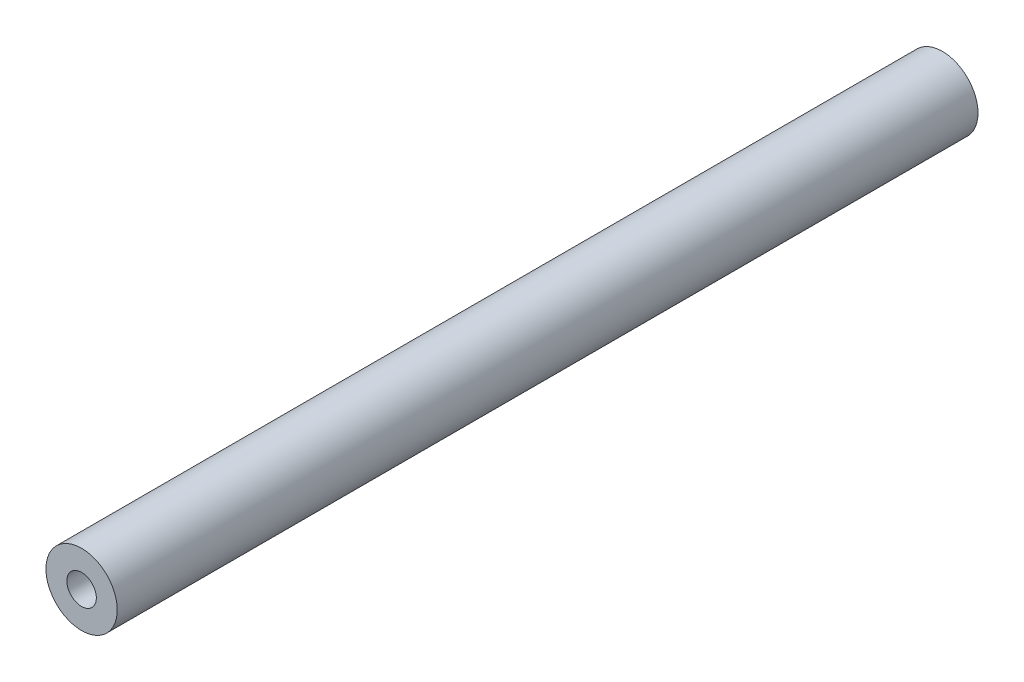
ISO-10303-21;
HEADER;
FILE_DESCRIPTION(('STEP AP214'),'2;1');
FILE_NAME('part.step','',(''),(''),'','','');
FILE_SCHEMA(('AUTOMOTIVE_DESIGN { 1 0 10303 214 1 1 1 1 }'));
ENDSEC;
DATA;
#1=APPLICATION_CONTEXT('core data for automotive mechanical design processes');
#2=APPLICATION_PROTOCOL_DEFINITION('international standard','automotive_design',2000,#1);
#3=PRODUCT_CONTEXT('',#1,'mechanical');
#4=PRODUCT('Part','Part','',(#3));
#5=PRODUCT_RELATED_PRODUCT_CATEGORY('part','',(#4));
#6=PRODUCT_DEFINITION_FORMATION('','',#4);
#7=PRODUCT_DEFINITION_CONTEXT('part definition',#1,'design');
#8=PRODUCT_DEFINITION('design','',#6,#7);
#9=PRODUCT_DEFINITION_SHAPE('','',#8);
#10=(LENGTH_UNIT() NAMED_UNIT(*) SI_UNIT(.MILLI.,.METRE.));
#11=(NAMED_UNIT(*) PLANE_ANGLE_UNIT() SI_UNIT($,.RADIAN.));
#12=(NAMED_UNIT(*) SI_UNIT($,.STERADIAN.) SOLID_ANGLE_UNIT());
#13=UNCERTAINTY_MEASURE_WITH_UNIT(LENGTH_MEASURE(1.E-05),#10,'distance_accuracy_value','');
#14=(GEOMETRIC_REPRESENTATION_CONTEXT(3) GLOBAL_UNCERTAINTY_ASSIGNED_CONTEXT((#13)) GLOBAL_UNIT_ASSIGNED_CONTEXT((#10,
#11,#12)) REPRESENTATION_CONTEXT('',''));
#15=CARTESIAN_POINT('',(0.,0.,0.));
#16=DIRECTION('',(0.,0.,1.));
#17=DIRECTION('',(1.,0.,0.));
#18=AXIS2_PLACEMENT_3D('',#15,#16,#17);
#19=CARTESIAN_POINT('',(0.,0.,177.8));
#20=DIRECTION('',(0.,0.,1.));
#21=DIRECTION('',(1.,0.,0.));
#22=AXIS2_PLACEMENT_3D('',#19,#20,#21);
#23=PLANE('',#22);
#24=CARTESIAN_POINT('',(0.,0.,177.8));
#25=DIRECTION('',(0.,0.,1.));
#26=DIRECTION('',(1.,0.,0.));
#27=AXIS2_PLACEMENT_3D('',#24,#25,#26);
#28=CIRCLE('',#27,7.366);
#29=CARTESIAN_POINT('',(7.366,0.,177.8));
#30=VERTEX_POINT('',#29);
#31=EDGE_CURVE('E10',#30,#30,#28,.T.);
#32=ORIENTED_EDGE('',*,*,#31,.T.);
#33=EDGE_LOOP('',(#32));
#34=FACE_BOUND('',#33,.T.);
#35=CARTESIAN_POINT('',(0.,0.,177.8));
#36=DIRECTION('',(0.,0.,1.));
#37=DIRECTION('',(1.,0.,0.));
#38=AXIS2_PLACEMENT_3D('',#35,#36,#37);
#39=CIRCLE('',#38,3.048);
#40=CARTESIAN_POINT('',(3.048,0.,177.8));
#41=VERTEX_POINT('',#40);
#42=EDGE_CURVE('E50',#41,#41,#39,.T.);
#43=ORIENTED_EDGE('',*,*,#42,.F.);
#44=EDGE_LOOP('',(#43));
#45=FACE_BOUND('',#44,.T.);
#46=ADVANCED_FACE('F39',(#34,#45),#23,.T.);
#47=CARTESIAN_POINT('',(0.,0.,0.));
#48=DIRECTION('',(0.,0.,1.));
#49=DIRECTION('',(1.,0.,0.));
#50=AXIS2_PLACEMENT_3D('',#47,#48,#49);
#51=PLANE('',#50);
#52=CARTESIAN_POINT('',(0.,0.,0.));
#53=DIRECTION('',(0.,0.,1.));
#54=DIRECTION('',(1.,0.,0.));
#55=AXIS2_PLACEMENT_3D('',#52,#53,#54);
#56=CIRCLE('',#55,7.366);
#57=CARTESIAN_POINT('',(7.366,0.,0.));
#58=VERTEX_POINT('',#57);
#59=EDGE_CURVE('E43',#58,#58,#56,.T.);
#60=ORIENTED_EDGE('',*,*,#59,.F.);
#61=EDGE_LOOP('',(#60));
#62=FACE_BOUND('',#61,.T.);
#63=CARTESIAN_POINT('',(0.,0.,0.));
#64=DIRECTION('',(0.,0.,1.));
#65=DIRECTION('',(1.,0.,0.));
#66=AXIS2_PLACEMENT_3D('',#63,#64,#65);
#67=CIRCLE('',#66,3.048);
#68=CARTESIAN_POINT('',(3.048,0.,0.));
#69=VERTEX_POINT('',#68);
#70=EDGE_CURVE('E52',#69,#69,#67,.T.);
#71=ORIENTED_EDGE('',*,*,#70,.T.);
#72=EDGE_LOOP('',(#71));
#73=FACE_BOUND('',#72,.T.);
#74=ADVANCED_FACE('F62',(#62,#73),#51,.F.);
#75=CARTESIAN_POINT('',(0.,0.,177.8));
#76=DIRECTION('',(0.,0.,-1.));
#77=DIRECTION('',(-1.,0.,0.));
#78=AXIS2_PLACEMENT_3D('',#75,#76,#77);
#79=CYLINDRICAL_SURFACE('',#78,7.366);
#80=ORIENTED_EDGE('',*,*,#31,.F.);
#81=EDGE_LOOP('',(#80));
#82=FACE_BOUND('',#81,.T.);
#83=ORIENTED_EDGE('',*,*,#59,.T.);
#84=EDGE_LOOP('',(#83));
#85=FACE_BOUND('',#84,.T.);
#86=ADVANCED_FACE('F41',(#82,#85),#79,.T.);
#87=CARTESIAN_POINT('',(0.,0.,177.8));
#88=DIRECTION('',(0.,0.,-1.));
#89=DIRECTION('',(-1.,0.,0.));
#90=AXIS2_PLACEMENT_3D('',#87,#88,#89);
#91=CYLINDRICAL_SURFACE('',#90,3.048);
#92=ORIENTED_EDGE('',*,*,#42,.T.);
#93=EDGE_LOOP('',(#92));
#94=FACE_BOUND('',#93,.T.);
#95=ORIENTED_EDGE('',*,*,#70,.F.);
#96=EDGE_LOOP('',(#95));
#97=FACE_BOUND('',#96,.T.);
#98=ADVANCED_FACE('F58',(#94,#97),#91,.F.);
#99=CLOSED_SHELL('',(#46,#74,#86,#98));
#100=MANIFOLD_SOLID_BREP('B2',#99);
#101=ADVANCED_BREP_SHAPE_REPRESENTATION('',(#18,#100),#14);
#102=SHAPE_DEFINITION_REPRESENTATION(#9,#101);
ENDSEC;
END-ISO-10303-21;
